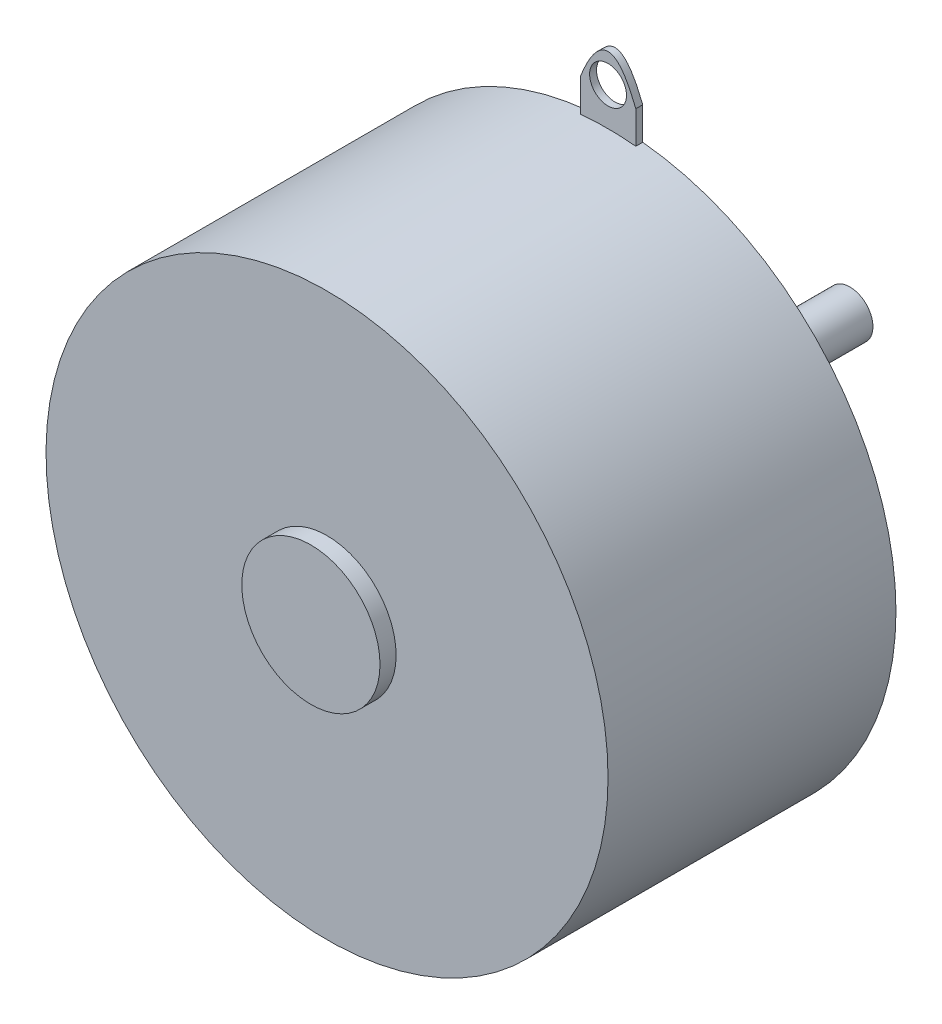
ISO-10303-21;
HEADER;
FILE_DESCRIPTION(('STEP AP214'),'2;1');
FILE_NAME('part.step','',(''),(''),'','','');
FILE_SCHEMA(('AUTOMOTIVE_DESIGN { 1 0 10303 214 1 1 1 1 }'));
ENDSEC;
DATA;
#1=APPLICATION_CONTEXT('core data for automotive mechanical design processes');
#2=APPLICATION_PROTOCOL_DEFINITION('international standard','automotive_design',2000,#1);
#3=PRODUCT_CONTEXT('',#1,'mechanical');
#4=PRODUCT('Part','Part','',(#3));
#5=PRODUCT_RELATED_PRODUCT_CATEGORY('part','',(#4));
#6=PRODUCT_DEFINITION_FORMATION('','',#4);
#7=PRODUCT_DEFINITION_CONTEXT('part definition',#1,'design');
#8=PRODUCT_DEFINITION('design','',#6,#7);
#9=PRODUCT_DEFINITION_SHAPE('','',#8);
#10=(LENGTH_UNIT() NAMED_UNIT(*) SI_UNIT(.MILLI.,.METRE.));
#11=(NAMED_UNIT(*) PLANE_ANGLE_UNIT() SI_UNIT($,.RADIAN.));
#12=(NAMED_UNIT(*) SI_UNIT($,.STERADIAN.) SOLID_ANGLE_UNIT());
#13=UNCERTAINTY_MEASURE_WITH_UNIT(LENGTH_MEASURE(1.E-05),#10,'distance_accuracy_value','');
#14=(GEOMETRIC_REPRESENTATION_CONTEXT(3) GLOBAL_UNCERTAINTY_ASSIGNED_CONTEXT((#13)) GLOBAL_UNIT_ASSIGNED_CONTEXT((#10,
#11,#12)) REPRESENTATION_CONTEXT('',''));
#15=CARTESIAN_POINT('',(0.,0.,0.));
#16=DIRECTION('',(0.,0.,1.));
#17=DIRECTION('',(1.,0.,0.));
#18=AXIS2_PLACEMENT_3D('',#15,#16,#17);
#19=CARTESIAN_POINT('',(0.,0.,-10.2));
#20=DIRECTION('',(0.,0.,1.));
#21=DIRECTION('',(1.,0.,0.));
#22=AXIS2_PLACEMENT_3D('',#19,#20,#21);
#23=CYLINDRICAL_SURFACE('',#22,1.);
#24=CARTESIAN_POINT('',(0.,0.,-10.2));
#25=DIRECTION('',(0.,0.,-1.));
#26=DIRECTION('',(-1.,0.,0.));
#27=AXIS2_PLACEMENT_3D('',#24,#25,#26);
#28=CIRCLE('',#27,1.);
#29=CARTESIAN_POINT('',(-1.,0.,-10.2));
#30=VERTEX_POINT('',#29);
#31=EDGE_CURVE('E230',#30,#30,#28,.T.);
#32=ORIENTED_EDGE('',*,*,#31,.F.);
#33=EDGE_LOOP('',(#32));
#34=FACE_BOUND('',#33,.T.);
#35=CARTESIAN_POINT('',(0.,0.,-0.5));
#36=DIRECTION('',(0.,0.,-1.));
#37=DIRECTION('',(-1.,0.,0.));
#38=AXIS2_PLACEMENT_3D('',#35,#36,#37);
#39=CIRCLE('',#38,1.);
#40=CARTESIAN_POINT('',(-1.,0.,-0.5));
#41=VERTEX_POINT('',#40);
#42=EDGE_CURVE('E306',#41,#41,#39,.T.);
#43=ORIENTED_EDGE('',*,*,#42,.T.);
#44=EDGE_LOOP('',(#43));
#45=FACE_BOUND('',#44,.T.);
#46=CARTESIAN_POINT('',(-0.998705608713358,-0.0508636129711779,-7.33370644444578));
#47=CARTESIAN_POINT('',(-0.998705716944618,-0.0508633764123314,-7.31741865906477));
#48=CARTESIAN_POINT('',(-0.99878075658933,-0.0494477899037423,-7.30112895965556));
#49=CARTESIAN_POINT('',(-0.999041819480778,-0.0438525692223105,-7.26903044913318));
#50=CARTESIAN_POINT('',(-0.999227882597141,-0.0396719420375029,-7.25322181291902));
#51=CARTESIAN_POINT('',(-0.999601583424431,-0.0287441892508261,-7.2225595486397));
#52=CARTESIAN_POINT('',(-0.999789217096529,-0.0220023745424902,-7.20770401821975));
#53=CARTESIAN_POINT('',(-1.00001176989093,-0.0062113170156004,-7.17927558002009));
#54=CARTESIAN_POINT('',(-1.00004666174059,0.00283833757140747,-7.16570290172183));
#55=CARTESIAN_POINT('',(-0.999782342607541,0.023316389049762,-7.139677363146));
#56=CARTESIAN_POINT('',(-0.999470887440874,0.0348195686668742,-7.12728347689725));
#57=CARTESIAN_POINT('',(-0.998297429563808,0.0596354550601853,-7.10449105409454));
#58=CARTESIAN_POINT('',(-0.997435316544868,0.0729485239751973,-7.09409291787484));
#59=CARTESIAN_POINT('',(-0.994943692487863,0.101482225852307,-7.07524397819532));
#60=CARTESIAN_POINT('',(-0.993289309802826,0.116752009141263,-7.06687056943663));
#61=CARTESIAN_POINT('',(-0.989061320789234,0.148363017927186,-7.05280484826686));
#62=CARTESIAN_POINT('',(-0.986487880426897,0.16470404954018,-7.04711205221267));
#63=CARTESIAN_POINT('',(-0.9804369440905,0.197520918305487,-7.03872818200092));
#64=CARTESIAN_POINT('',(-0.97698427456049,0.213982598843931,-7.03596400482312));
#65=CARTESIAN_POINT('',(-0.969182500776432,0.246923989023454,-7.0333029650169));
#66=CARTESIAN_POINT('',(-0.964833643183509,0.26340369246522,-7.03340531446735));
#67=CARTESIAN_POINT('',(-0.9555703758073,0.295209630253265,-7.03642694427336));
#68=CARTESIAN_POINT('',(-0.950685923528052,0.310555565067581,-7.0392322191736));
#69=CARTESIAN_POINT('',(-0.940422986238158,0.340372304548141,-7.04740889286613));
#70=CARTESIAN_POINT('',(-0.935044497019086,0.354843101757834,-7.05278031351963));
#71=CARTESIAN_POINT('',(-0.924052948553754,0.382555493379285,-7.06592659146047));
#72=CARTESIAN_POINT('',(-0.918439799026192,0.395796608262836,-7.07370238128308));
#73=CARTESIAN_POINT('',(-0.907276364629243,0.420757425416011,-7.09143540789827));
#74=CARTESIAN_POINT('',(-0.901726092215073,0.432476830901635,-7.10139306921374));
#75=CARTESIAN_POINT('',(-0.890819949463864,0.454528730919662,-7.12359767966014));
#76=CARTESIAN_POINT('',(-0.885476824623317,0.464801595593181,-7.13591015707379));
#77=CARTESIAN_POINT('',(-0.875531615741424,0.483275022132097,-7.16226948678126));
#78=CARTESIAN_POINT('',(-0.870929618160234,0.491475342277193,-7.17631654109419));
#79=CARTESIAN_POINT('',(-0.862724184131898,0.505743048100308,-7.20600670955148));
#80=CARTESIAN_POINT('',(-0.859136882827554,0.511776340874608,-7.22167072912599));
#81=CARTESIAN_POINT('',(-0.853335817979085,0.52139220763765,-7.25397455698763));
#82=CARTESIAN_POINT('',(-0.851121749310471,0.524975326059367,-7.27061414760842));
#83=CARTESIAN_POINT('',(-0.848288434602472,0.52954116386324,-7.30394677426925));
#84=CARTESIAN_POINT('',(-0.847630232748236,0.530587418986592,-7.32062779280376));
#85=CARTESIAN_POINT('',(-0.847848970441963,0.530237860279917,-7.35395286530404));
#86=CARTESIAN_POINT('',(-0.848725737217097,0.528842321293093,-7.3705969232189));
#87=CARTESIAN_POINT('',(-0.85190782085865,0.523700084088964,-7.40302098846038));
#88=CARTESIAN_POINT('',(-0.854183492332869,0.520002157386236,-7.41881171312303));
#89=CARTESIAN_POINT('',(-0.859963564978484,0.510386054018927,-7.44946445137023));
#90=CARTESIAN_POINT('',(-0.863468129842017,0.504467581563905,-7.46432634092037));
#91=CARTESIAN_POINT('',(-0.871540138277755,0.490392371359663,-7.49303410936871));
#92=CARTESIAN_POINT('',(-0.876127747826425,0.482192562550929,-7.5068531794439));
#93=CARTESIAN_POINT('',(-0.886016017402827,0.463772209848248,-7.53278611368694));
#94=CARTESIAN_POINT('',(-0.891316806075638,0.45355130122652,-7.54489966940109));
#95=CARTESIAN_POINT('',(-0.90244528992017,0.430992441352353,-7.56740300677885));
#96=CARTESIAN_POINT('',(-0.9082831504557,0.418606045419065,-7.577739318976));
#97=CARTESIAN_POINT('',(-0.920002456694621,0.392178598511561,-7.59599009844853));
#98=CARTESIAN_POINT('',(-0.925883897720874,0.37813772275628,-7.60390482186538));
#99=CARTESIAN_POINT('',(-0.937273521242679,0.348941698115296,-7.61697327528439));
#100=CARTESIAN_POINT('',(-0.942785688168521,0.333804271922877,-7.62216304251966));
#101=CARTESIAN_POINT('',(-0.953239314946367,0.302661899830245,-7.62977000463788));
#102=CARTESIAN_POINT('',(-0.958180915683786,0.28665716952693,-7.63218788528325));
#103=CARTESIAN_POINT('',(-0.967130607467775,0.254799981584007,-7.63414484310925));
#104=CARTESIAN_POINT('',(-0.971164458682558,0.238960435055554,-7.6337777969991));
#105=CARTESIAN_POINT('',(-0.978396539401229,0.207371184659519,-7.63041677996104));
#106=CARTESIAN_POINT('',(-0.981594769256603,0.191621480754151,-7.6274228101381));
#107=CARTESIAN_POINT('',(-0.987134762397554,0.160662539840609,-7.61892456075475));
#108=CARTESIAN_POINT('',(-0.989476579069829,0.145453269196534,-7.61342043771922));
#109=CARTESIAN_POINT('',(-0.993362179592225,0.115985934623239,-7.60008001045395));
#110=CARTESIAN_POINT('',(-0.994905797279519,0.101728069287737,-7.59224322116252));
#111=CARTESIAN_POINT('',(-0.997359539766386,0.0739965231068079,-7.57409655299247));
#112=CARTESIAN_POINT('',(-0.998241975811153,0.060576715454563,-7.56370058417415));
#113=CARTESIAN_POINT('',(-0.999446508178879,0.0355519542753818,-7.54088228228631));
#114=CARTESIAN_POINT('',(-0.999768425270063,0.0239475823320898,-7.52845930244718));
#115=CARTESIAN_POINT('',(-1.00005523128115,0.00261266715766117,-7.50149986101968));
#116=CARTESIAN_POINT('',(-1.00000959214432,-0.00705442926915381,-7.48691291484239));
#117=CARTESIAN_POINT('',(-0.999753737395417,-0.0237128610936738,-7.45628818990179));
#118=CARTESIAN_POINT('',(-0.999543621583863,-0.030705815268227,-7.44025129614957));
#119=CARTESIAN_POINT('',(-0.999169647733033,-0.041027924181401,-7.40923289707969));
#120=CARTESIAN_POINT('',(-0.99900328241709,-0.0447031794934045,-7.39436607013143));
#121=CARTESIAN_POINT('',(-0.998771225179704,-0.0496208207894637,-7.36423546837426));
#122=CARTESIAN_POINT('',(-0.998705507276096,-0.0508638346805213,-7.34897179704593));
#123=CARTESIAN_POINT('',(-0.998705608713358,-0.0508636129711779,-7.33370644444578));
#124=B_SPLINE_CURVE_WITH_KNOTS('',3,(#46,#47,#48,#49,#50,#51,#52,#53,#54,#55,#56,#57,#58,#59,
#60,#61,#62,#63,#64,#65,#66,#67,#68,#69,#70,#71,#72,#73,#74,#75,#76,#77,#78,#79,#80,#81,#82,#83,
#84,#85,#86,#87,#88,#89,#90,#91,#92,#93,#94,#95,#96,#97,#98,#99,#100,#101,#102,#103,#104,#105,
#106,#107,#108,#109,#110,#111,#112,#113,#114,#115,#116,#117,#118,#119,#120,#121,#122,#123),
.UNSPECIFIED.,.T.,.F.,(4,2,2,2,2,2,2,2,2,2,2,2,2,2,2,2,2,2,2,2,2,2,2,2,2,2,2,2,2,2,2,2,2,2,2,2,
2,2,4),(0.,0.0488064602400062,0.0976304579198164,0.146353761649586,0.195085764758133,
0.245596912417653,0.296118181714702,0.348341264699459,0.400554921846387,0.451432106442574,
0.502295306582772,0.551103014191679,0.599911137604854,0.648738215057718,0.697574801158179,
0.748047777990534,0.798526638758741,0.849768066157882,0.900998103920283,0.950931192321792,
1.00085866072159,1.04976290054783,1.09867365703569,1.14857909444745,1.19849354602958,
1.24971557332734,1.30093218078499,1.35145321547015,1.40196174859477,1.45077545222193,
1.49958913531665,1.54839977496721,1.59722057154882,1.64798640987592,1.69876847812973,
1.7510101809105,1.80322020922216,1.84897475618952,1.89471748961215),.UNSPECIFIED.);
#125=CARTESIAN_POINT('',(-0.998705608713358,-0.0508636129711779,-7.33370644444578));
#126=VERTEX_POINT('',#125);
#127=EDGE_CURVE('E41',#126,#126,#124,.T.);
#128=ORIENTED_EDGE('',*,*,#127,.F.);
#129=EDGE_LOOP('',(#128));
#130=FACE_BOUND('',#129,.T.);
#131=ADVANCED_FACE('F37',(#34,#45,#130),#23,.T.);
#132=CARTESIAN_POINT('',(0.,0.,-1.));
#133=DIRECTION('',(0.,0.,1.));
#134=DIRECTION('',(1.,0.,0.));
#135=AXIS2_PLACEMENT_3D('',#132,#133,#134);
#136=CYLINDRICAL_SURFACE('',#135,3.25);
#137=CARTESIAN_POINT('',(0.,0.,0.));
#138=DIRECTION('',(0.,0.,-1.));
#139=DIRECTION('',(-1.,0.,0.));
#140=AXIS2_PLACEMENT_3D('',#137,#138,#139);
#141=CIRCLE('',#140,3.25);
#142=CARTESIAN_POINT('',(-3.25,0.,0.));
#143=VERTEX_POINT('',#142);
#144=EDGE_CURVE('E11',#143,#143,#141,.T.);
#145=ORIENTED_EDGE('',*,*,#144,.T.);
#146=EDGE_LOOP('',(#145));
#147=FACE_BOUND('',#146,.T.);
#148=CARTESIAN_POINT('',(0.,0.,-0.5));
#149=DIRECTION('',(0.,0.,-1.));
#150=DIRECTION('',(-1.,0.,0.));
#151=AXIS2_PLACEMENT_3D('',#148,#149,#150);
#152=CIRCLE('',#151,3.25);
#153=CARTESIAN_POINT('',(-3.25,0.,-0.5));
#154=VERTEX_POINT('',#153);
#155=EDGE_CURVE('E302',#154,#154,#152,.T.);
#156=ORIENTED_EDGE('',*,*,#155,.F.);
#157=EDGE_LOOP('',(#156));
#158=FACE_BOUND('',#157,.T.);
#159=ADVANCED_FACE('F322',(#147,#158),#136,.T.);
#160=CARTESIAN_POINT('',(0.,0.,12.5));
#161=DIRECTION('',(0.,0.,-1.));
#162=DIRECTION('',(-1.,0.,0.));
#163=AXIS2_PLACEMENT_3D('',#160,#161,#162);
#164=CYLINDRICAL_SURFACE('',#163,12.2);
#165=CARTESIAN_POINT('',(0.,0.,0.3));
#166=DIRECTION('',(0.,0.,-1.));
#167=DIRECTION('',(-1.,0.,0.));
#168=AXIS2_PLACEMENT_3D('',#165,#166,#167);
#169=CIRCLE('',#168,12.2);
#170=CARTESIAN_POINT('',(1.20565428691612,-12.140279969607,0.3));
#171=VERTEX_POINT('',#170);
#172=CARTESIAN_POINT('',(-1.20565428691612,-12.140279969607,0.3));
#173=VERTEX_POINT('',#172);
#174=EDGE_CURVE('E64',#171,#173,#169,.T.);
#175=ORIENTED_EDGE('',*,*,#174,.F.);
#176=DIRECTION('',(0.,0.,-1.));
#177=VECTOR('',#176,1.);
#178=CARTESIAN_POINT('',(1.20565428691612,-12.140279969607,0.3));
#179=LINE('',#178,#177);
#180=CARTESIAN_POINT('',(1.20565428691612,-12.140279969607,0.));
#181=VERTEX_POINT('',#180);
#182=EDGE_CURVE('E129',#171,#181,#179,.T.);
#183=ORIENTED_EDGE('',*,*,#182,.T.);
#184=CARTESIAN_POINT('',(0.,0.,0.));
#185=DIRECTION('',(0.,0.,1.));
#186=DIRECTION('',(1.,0.,0.));
#187=AXIS2_PLACEMENT_3D('',#184,#185,#186);
#188=CIRCLE('',#187,12.2);
#189=CARTESIAN_POINT('',(1.20565428691612,12.140279969607,0.));
#190=VERTEX_POINT('',#189);
#191=EDGE_CURVE('E268',#181,#190,#188,.T.);
#192=ORIENTED_EDGE('',*,*,#191,.T.);
#193=DIRECTION('',(0.,0.,-1.));
#194=VECTOR('',#193,1.);
#195=CARTESIAN_POINT('',(1.20565428691612,12.140279969607,0.3));
#196=LINE('',#195,#194);
#197=CARTESIAN_POINT('',(1.20565428691612,12.140279969607,0.3));
#198=VERTEX_POINT('',#197);
#199=EDGE_CURVE('E222',#198,#190,#196,.T.);
#200=ORIENTED_EDGE('',*,*,#199,.F.);
#201=CARTESIAN_POINT('',(0.,0.,0.3));
#202=DIRECTION('',(0.,0.,-1.));
#203=DIRECTION('',(-1.,0.,0.));
#204=AXIS2_PLACEMENT_3D('',#201,#202,#203);
#205=CIRCLE('',#204,12.2);
#206=CARTESIAN_POINT('',(-1.20565428691612,12.140279969607,0.3));
#207=VERTEX_POINT('',#206);
#208=EDGE_CURVE('E191',#207,#198,#205,.T.);
#209=ORIENTED_EDGE('',*,*,#208,.F.);
#210=DIRECTION('',(0.,0.,-1.));
#211=VECTOR('',#210,1.);
#212=CARTESIAN_POINT('',(-1.20565428691612,12.140279969607,0.3));
#213=LINE('',#212,#211);
#214=CARTESIAN_POINT('',(-1.20565428691612,12.140279969607,0.));
#215=VERTEX_POINT('',#214);
#216=EDGE_CURVE('E219',#207,#215,#213,.T.);
#217=ORIENTED_EDGE('',*,*,#216,.T.);
#218=CARTESIAN_POINT('',(-1.20565428691612,-12.140279969607,0.));
#219=VERTEX_POINT('',#218);
#220=EDGE_CURVE('E273',#215,#219,#188,.T.);
#221=ORIENTED_EDGE('',*,*,#220,.T.);
#222=DIRECTION('',(0.,0.,-1.));
#223=VECTOR('',#222,1.);
#224=CARTESIAN_POINT('',(-1.20565428691612,-12.140279969607,0.3));
#225=LINE('',#224,#223);
#226=EDGE_CURVE('E59',#173,#219,#225,.T.);
#227=ORIENTED_EDGE('',*,*,#226,.F.);
#228=EDGE_LOOP('',(#175,#183,#192,#200,#209,#217,#221,#227));
#229=FACE_BOUND('',#228,.T.);
#230=CARTESIAN_POINT('',(0.,0.,12.5));
#231=DIRECTION('',(0.,0.,1.));
#232=DIRECTION('',(1.,0.,0.));
#233=AXIS2_PLACEMENT_3D('',#230,#231,#232);
#234=CIRCLE('',#233,12.2);
#235=CARTESIAN_POINT('',(12.2,0.,12.5));
#236=VERTEX_POINT('',#235);
#237=EDGE_CURVE('E271',#236,#236,#234,.T.);
#238=ORIENTED_EDGE('',*,*,#237,.F.);
#239=EDGE_LOOP('',(#238));
#240=FACE_BOUND('',#239,.T.);
#241=ADVANCED_FACE('F39',(#229,#240),#164,.T.);
#242=CARTESIAN_POINT('',(0.,0.,12.5));
#243=DIRECTION('',(0.,0.,1.));
#244=DIRECTION('',(1.,0.,0.));
#245=AXIS2_PLACEMENT_3D('',#242,#243,#244);
#246=PLANE('',#245);
#247=CARTESIAN_POINT('',(0.,0.,12.5));
#248=DIRECTION('',(0.,0.,1.));
#249=DIRECTION('',(1.,0.,0.));
#250=AXIS2_PLACEMENT_3D('',#247,#248,#249);
#251=CIRCLE('',#250,3.);
#252=CARTESIAN_POINT('',(3.,0.,12.5));
#253=VERTEX_POINT('',#252);
#254=EDGE_CURVE('E51',#253,#253,#251,.T.);
#255=ORIENTED_EDGE('',*,*,#254,.F.);
#256=EDGE_LOOP('',(#255));
#257=FACE_BOUND('',#256,.T.);
#258=ORIENTED_EDGE('',*,*,#237,.T.);
#259=EDGE_LOOP('',(#258));
#260=FACE_BOUND('',#259,.T.);
#261=ADVANCED_FACE('F295',(#257,#260),#246,.T.);
#262=CARTESIAN_POINT('',(0.,0.,0.));
#263=DIRECTION('',(0.,0.,1.));
#264=DIRECTION('',(1.,0.,0.));
#265=AXIS2_PLACEMENT_3D('',#262,#263,#264);
#266=PLANE('',#265);
#267=CARTESIAN_POINT('',(0.,8.25,0.));
#268=DIRECTION('',(0.,0.,-1.));
#269=DIRECTION('',(-1.,0.,0.));
#270=AXIS2_PLACEMENT_3D('',#267,#268,#269);
#271=CIRCLE('',#270,0.85);
#272=CARTESIAN_POINT('',(-0.85,8.25,0.));
#273=VERTEX_POINT('',#272);
#274=EDGE_CURVE('E231',#273,#273,#271,.T.);
#275=ORIENTED_EDGE('',*,*,#274,.F.);
#276=EDGE_LOOP('',(#275));
#277=FACE_BOUND('',#276,.T.);
#278=CARTESIAN_POINT('',(-7.14470958122185,4.12500000000041,0.));
#279=DIRECTION('',(0.,0.,-1.));
#280=DIRECTION('',(-1.,0.,0.));
#281=AXIS2_PLACEMENT_3D('',#278,#279,#280);
#282=CIRCLE('',#281,0.850000000000126);
#283=CARTESIAN_POINT('',(-7.99470958122198,4.12500000000041,0.));
#284=VERTEX_POINT('',#283);
#285=EDGE_CURVE('E235',#284,#284,#282,.T.);
#286=ORIENTED_EDGE('',*,*,#285,.F.);
#287=EDGE_LOOP('',(#286));
#288=FACE_BOUND('',#287,.T.);
#289=CARTESIAN_POINT('',(-7.14470958122232,-4.12499999999959,0.));
#290=DIRECTION('',(0.,0.,-1.));
#291=DIRECTION('',(-1.,0.,0.));
#292=AXIS2_PLACEMENT_3D('',#289,#290,#291);
#293=CIRCLE('',#292,0.850000000000591);
#294=CARTESIAN_POINT('',(-7.99470958122291,-4.12499999999959,0.));
#295=VERTEX_POINT('',#294);
#296=EDGE_CURVE('E258',#295,#295,#293,.T.);
#297=ORIENTED_EDGE('',*,*,#296,.F.);
#298=EDGE_LOOP('',(#297));
#299=FACE_BOUND('',#298,.T.);
#300=CARTESIAN_POINT('',(-9.35895743984739E-13,-8.25,0.));
#301=DIRECTION('',(0.,0.,-1.));
#302=DIRECTION('',(-1.,0.,0.));
#303=AXIS2_PLACEMENT_3D('',#300,#301,#302);
#304=CIRCLE('',#303,0.85000000000095);
#305=CARTESIAN_POINT('',(-0.850000000001886,-8.25,0.));
#306=VERTEX_POINT('',#305);
#307=EDGE_CURVE('E252',#306,#306,#304,.T.);
#308=ORIENTED_EDGE('',*,*,#307,.F.);
#309=EDGE_LOOP('',(#308));
#310=FACE_BOUND('',#309,.T.);
#311=CARTESIAN_POINT('',(7.14470958122092,-4.12500000000041,0.));
#312=DIRECTION('',(0.,0.,-1.));
#313=DIRECTION('',(-1.,0.,0.));
#314=AXIS2_PLACEMENT_3D('',#311,#312,#313);
#315=CIRCLE('',#314,0.850000000000865);
#316=CARTESIAN_POINT('',(6.29470958122005,-4.12500000000041,0.));
#317=VERTEX_POINT('',#316);
#318=EDGE_CURVE('E246',#317,#317,#315,.T.);
#319=ORIENTED_EDGE('',*,*,#318,.F.);
#320=EDGE_LOOP('',(#319));
#321=FACE_BOUND('',#320,.T.);
#322=CARTESIAN_POINT('',(7.14470958122139,4.12499999999959,0.));
#323=DIRECTION('',(0.,0.,-1.));
#324=DIRECTION('',(-1.,0.,0.));
#325=AXIS2_PLACEMENT_3D('',#322,#323,#324);
#326=CIRCLE('',#325,0.85000000000044);
#327=CARTESIAN_POINT('',(6.29470958122095,4.12499999999959,0.));
#328=VERTEX_POINT('',#327);
#329=EDGE_CURVE('E234',#328,#328,#326,.T.);
#330=ORIENTED_EDGE('',*,*,#329,.F.);
#331=EDGE_LOOP('',(#330));
#332=FACE_BOUND('',#331,.T.);
#333=ORIENTED_EDGE('',*,*,#144,.F.);
#334=EDGE_LOOP('',(#333));
#335=FACE_BOUND('',#334,.T.);
#336=ORIENTED_EDGE('',*,*,#220,.F.);
#337=DIRECTION('',(0.,1.,0.));
#338=VECTOR('',#337,1.);
#339=CARTESIAN_POINT('',(-1.20565428691612,0.,0.));
#340=LINE('',#339,#338);
#341=CARTESIAN_POINT('',(-1.20565428691612,13.550279969607,0.));
#342=VERTEX_POINT('',#341);
#343=EDGE_CURVE('E211',#215,#342,#340,.T.);
#344=ORIENTED_EDGE('',*,*,#343,.T.);
#345=CARTESIAN_POINT('',(1.20565428691612,13.550279969607,0.));
#346=CARTESIAN_POINT('',(0.,16.6469458550906,0.));
#347=CARTESIAN_POINT('',(-1.20565428691612,13.550279969607,0.));
#348=B_SPLINE_CURVE_WITH_KNOTS('',2,(#345,#346,#347),.UNSPECIFIED.,.F.,.F.,(3,3),(0.,1.),.UNSPECIFIED.);
#349=CARTESIAN_POINT('',(1.20565428691612,13.550279969607,0.));
#350=VERTEX_POINT('',#349);
#351=EDGE_CURVE('E201',#350,#342,#348,.T.);
#352=ORIENTED_EDGE('',*,*,#351,.F.);
#353=DIRECTION('',(0.,1.,0.));
#354=VECTOR('',#353,1.);
#355=CARTESIAN_POINT('',(1.20565428691612,0.,0.));
#356=LINE('',#355,#354);
#357=EDGE_CURVE('E206',#190,#350,#356,.T.);
#358=ORIENTED_EDGE('',*,*,#357,.F.);
#359=ORIENTED_EDGE('',*,*,#191,.F.);
#360=DIRECTION('',(0.,-1.,0.));
#361=VECTOR('',#360,1.);
#362=CARTESIAN_POINT('',(1.20565428691612,0.,0.));
#363=LINE('',#362,#361);
#364=CARTESIAN_POINT('',(1.20565428691612,-13.550279969607,0.));
#365=VERTEX_POINT('',#364);
#366=EDGE_CURVE('E301',#181,#365,#363,.T.);
#367=ORIENTED_EDGE('',*,*,#366,.T.);
#368=CARTESIAN_POINT('',(1.20565428691612,-13.550279969607,0.));
#369=CARTESIAN_POINT('',(0.,-16.6469458550906,0.));
#370=CARTESIAN_POINT('',(-1.20565428691612,-13.550279969607,0.));
#371=B_SPLINE_CURVE_WITH_KNOTS('',2,(#368,#369,#370),.UNSPECIFIED.,.F.,.F.,(3,3),(0.,1.),.UNSPECIFIED.);
#372=CARTESIAN_POINT('',(-1.20565428691612,-13.550279969607,0.));
#373=VERTEX_POINT('',#372);
#374=EDGE_CURVE('E114',#365,#373,#371,.T.);
#375=ORIENTED_EDGE('',*,*,#374,.T.);
#376=DIRECTION('',(0.,-1.,0.));
#377=VECTOR('',#376,1.);
#378=CARTESIAN_POINT('',(-1.20565428691612,0.,0.));
#379=LINE('',#378,#377);
#380=EDGE_CURVE('E133',#219,#373,#379,.T.);
#381=ORIENTED_EDGE('',*,*,#380,.F.);
#382=EDGE_LOOP('',(#336,#344,#352,#358,#359,#367,#375,#381));
#383=FACE_BOUND('',#382,.T.);
#384=CARTESIAN_POINT('',(0.,13.85,0.));
#385=DIRECTION('',(0.,0.,-1.));
#386=DIRECTION('',(-1.,0.,0.));
#387=AXIS2_PLACEMENT_3D('',#384,#385,#386);
#388=CIRCLE('',#387,0.8);
#389=CARTESIAN_POINT('',(-0.8,13.85,0.));
#390=VERTEX_POINT('',#389);
#391=EDGE_CURVE('E185',#390,#390,#388,.T.);
#392=ORIENTED_EDGE('',*,*,#391,.F.);
#393=EDGE_LOOP('',(#392));
#394=FACE_BOUND('',#393,.T.);
#395=CARTESIAN_POINT('',(0.,-13.85,0.));
#396=DIRECTION('',(0.,0.,-1.));
#397=DIRECTION('',(-1.,0.,0.));
#398=AXIS2_PLACEMENT_3D('',#395,#396,#397);
#399=CIRCLE('',#398,0.8);
#400=CARTESIAN_POINT('',(-0.8,-13.85,0.));
#401=VERTEX_POINT('',#400);
#402=EDGE_CURVE('E299',#401,#401,#399,.F.);
#403=ORIENTED_EDGE('',*,*,#402,.T.);
#404=EDGE_LOOP('',(#403));
#405=FACE_BOUND('',#404,.T.);
#406=ADVANCED_FACE('F281',(#277,#288,#299,#310,#321,#332,#335,#383,#394,#405),#266,.F.);
#407=CARTESIAN_POINT('',(0.,0.,13.2));
#408=DIRECTION('',(0.,0.,-1.));
#409=DIRECTION('',(-1.,0.,0.));
#410=AXIS2_PLACEMENT_3D('',#407,#408,#409);
#411=CYLINDRICAL_SURFACE('',#410,3.);
#412=CARTESIAN_POINT('',(0.,0.,13.2));
#413=DIRECTION('',(0.,0.,1.));
#414=DIRECTION('',(1.,0.,0.));
#415=AXIS2_PLACEMENT_3D('',#412,#413,#414);
#416=CIRCLE('',#415,3.);
#417=CARTESIAN_POINT('',(3.,0.,13.2));
#418=VERTEX_POINT('',#417);
#419=EDGE_CURVE('E264',#418,#418,#416,.T.);
#420=ORIENTED_EDGE('',*,*,#419,.F.);
#421=EDGE_LOOP('',(#420));
#422=FACE_BOUND('',#421,.T.);
#423=ORIENTED_EDGE('',*,*,#254,.T.);
#424=EDGE_LOOP('',(#423));
#425=FACE_BOUND('',#424,.T.);
#426=ADVANCED_FACE('F294',(#422,#425),#411,.T.);
#427=CARTESIAN_POINT('',(0.,0.,13.2));
#428=DIRECTION('',(0.,0.,1.));
#429=DIRECTION('',(1.,0.,0.));
#430=AXIS2_PLACEMENT_3D('',#427,#428,#429);
#431=PLANE('',#430);
#432=ORIENTED_EDGE('',*,*,#419,.T.);
#433=EDGE_LOOP('',(#432));
#434=FACE_BOUND('',#433,.T.);
#435=ADVANCED_FACE('F338',(#434),#431,.T.);
#436=CARTESIAN_POINT('',(7.14470958122139,4.12499999999959,0.35));
#437=DIRECTION('',(0.,0.,-1.));
#438=DIRECTION('',(-1.,0.,0.));
#439=AXIS2_PLACEMENT_3D('',#436,#437,#438);
#440=CYLINDRICAL_SURFACE('',#439,0.85000000000044);
#441=CARTESIAN_POINT('',(7.14470958122139,4.12499999999959,0.35));
#442=DIRECTION('',(0.,0.,-1.));
#443=DIRECTION('',(-1.,0.,0.));
#444=AXIS2_PLACEMENT_3D('',#441,#442,#443);
#445=CIRCLE('',#444,0.85000000000044);
#446=CARTESIAN_POINT('',(6.29470958122095,4.12499999999959,0.35));
#447=VERTEX_POINT('',#446);
#448=EDGE_CURVE('E243',#447,#447,#445,.T.);
#449=ORIENTED_EDGE('',*,*,#448,.F.);
#450=EDGE_LOOP('',(#449));
#451=FACE_BOUND('',#450,.T.);
#452=ORIENTED_EDGE('',*,*,#329,.T.);
#453=EDGE_LOOP('',(#452));
#454=FACE_BOUND('',#453,.T.);
#455=ADVANCED_FACE('F341',(#451,#454),#440,.F.);
#456=CARTESIAN_POINT('',(7.14470958122139,4.12499999999959,0.35));
#457=DIRECTION('',(0.,0.,-1.));
#458=DIRECTION('',(-1.,0.,0.));
#459=AXIS2_PLACEMENT_3D('',#456,#457,#458);
#460=PLANE('',#459);
#461=ORIENTED_EDGE('',*,*,#448,.T.);
#462=EDGE_LOOP('',(#461));
#463=FACE_BOUND('',#462,.T.);
#464=ADVANCED_FACE('F441',(#463),#460,.T.);
#465=CARTESIAN_POINT('',(7.14470958122092,-4.12500000000041,0.35));
#466=DIRECTION('',(0.,0.,-1.));
#467=DIRECTION('',(-1.,0.,0.));
#468=AXIS2_PLACEMENT_3D('',#465,#466,#467);
#469=CYLINDRICAL_SURFACE('',#468,0.850000000000865);
#470=CARTESIAN_POINT('',(7.14470958122092,-4.12500000000041,0.35));
#471=DIRECTION('',(0.,0.,-1.));
#472=DIRECTION('',(-1.,0.,0.));
#473=AXIS2_PLACEMENT_3D('',#470,#471,#472);
#474=CIRCLE('',#473,0.850000000000865);
#475=CARTESIAN_POINT('',(6.29470958122005,-4.12500000000041,0.35));
#476=VERTEX_POINT('',#475);
#477=EDGE_CURVE('E249',#476,#476,#474,.T.);
#478=ORIENTED_EDGE('',*,*,#477,.F.);
#479=EDGE_LOOP('',(#478));
#480=FACE_BOUND('',#479,.T.);
#481=ORIENTED_EDGE('',*,*,#318,.T.);
#482=EDGE_LOOP('',(#481));
#483=FACE_BOUND('',#482,.T.);
#484=ADVANCED_FACE('F451',(#480,#483),#469,.F.);
#485=CARTESIAN_POINT('',(7.14470958122092,-4.12500000000041,0.35));
#486=DIRECTION('',(0.,0.,-1.));
#487=DIRECTION('',(-1.,0.,0.));
#488=AXIS2_PLACEMENT_3D('',#485,#486,#487);
#489=PLANE('',#488);
#490=ORIENTED_EDGE('',*,*,#477,.T.);
#491=EDGE_LOOP('',(#490));
#492=FACE_BOUND('',#491,.T.);
#493=ADVANCED_FACE('F461',(#492),#489,.T.);
#494=CARTESIAN_POINT('',(-9.35895743984739E-13,-8.25,0.35));
#495=DIRECTION('',(0.,0.,-1.));
#496=DIRECTION('',(-1.,0.,0.));
#497=AXIS2_PLACEMENT_3D('',#494,#495,#496);
#498=CYLINDRICAL_SURFACE('',#497,0.85000000000095);
#499=CARTESIAN_POINT('',(-9.35895743984739E-13,-8.25,0.35));
#500=DIRECTION('',(0.,0.,-1.));
#501=DIRECTION('',(-1.,0.,0.));
#502=AXIS2_PLACEMENT_3D('',#499,#500,#501);
#503=CIRCLE('',#502,0.85000000000095);
#504=CARTESIAN_POINT('',(-0.850000000001886,-8.25,0.35));
#505=VERTEX_POINT('',#504);
#506=EDGE_CURVE('E255',#505,#505,#503,.T.);
#507=ORIENTED_EDGE('',*,*,#506,.F.);
#508=EDGE_LOOP('',(#507));
#509=FACE_BOUND('',#508,.T.);
#510=ORIENTED_EDGE('',*,*,#307,.T.);
#511=EDGE_LOOP('',(#510));
#512=FACE_BOUND('',#511,.T.);
#513=ADVANCED_FACE('F471',(#509,#512),#498,.F.);
#514=CARTESIAN_POINT('',(-9.35895743984739E-13,-8.25,0.35));
#515=DIRECTION('',(0.,0.,-1.));
#516=DIRECTION('',(-1.,0.,0.));
#517=AXIS2_PLACEMENT_3D('',#514,#515,#516);
#518=PLANE('',#517);
#519=ORIENTED_EDGE('',*,*,#506,.T.);
#520=EDGE_LOOP('',(#519));
#521=FACE_BOUND('',#520,.T.);
#522=ADVANCED_FACE('F481',(#521),#518,.T.);
#523=CARTESIAN_POINT('',(-7.14470958122232,-4.12499999999959,0.35));
#524=DIRECTION('',(0.,0.,-1.));
#525=DIRECTION('',(-1.,0.,0.));
#526=AXIS2_PLACEMENT_3D('',#523,#524,#525);
#527=CYLINDRICAL_SURFACE('',#526,0.850000000000591);
#528=CARTESIAN_POINT('',(-7.14470958122232,-4.12499999999959,0.35));
#529=DIRECTION('',(0.,0.,-1.));
#530=DIRECTION('',(-1.,0.,0.));
#531=AXIS2_PLACEMENT_3D('',#528,#529,#530);
#532=CIRCLE('',#531,0.850000000000591);
#533=CARTESIAN_POINT('',(-7.99470958122291,-4.12499999999959,0.35));
#534=VERTEX_POINT('',#533);
#535=EDGE_CURVE('E238',#534,#534,#532,.T.);
#536=ORIENTED_EDGE('',*,*,#535,.F.);
#537=EDGE_LOOP('',(#536));
#538=FACE_BOUND('',#537,.T.);
#539=ORIENTED_EDGE('',*,*,#296,.T.);
#540=EDGE_LOOP('',(#539));
#541=FACE_BOUND('',#540,.T.);
#542=ADVANCED_FACE('F491',(#538,#541),#527,.F.);
#543=CARTESIAN_POINT('',(-7.14470958122232,-4.12499999999959,0.35));
#544=DIRECTION('',(0.,0.,-1.));
#545=DIRECTION('',(-1.,0.,0.));
#546=AXIS2_PLACEMENT_3D('',#543,#544,#545);
#547=PLANE('',#546);
#548=ORIENTED_EDGE('',*,*,#535,.T.);
#549=EDGE_LOOP('',(#548));
#550=FACE_BOUND('',#549,.T.);
#551=ADVANCED_FACE('F501',(#550),#547,.T.);
#552=CARTESIAN_POINT('',(-7.14470958122185,4.12500000000041,0.35));
#553=DIRECTION('',(0.,0.,-1.));
#554=DIRECTION('',(-1.,0.,0.));
#555=AXIS2_PLACEMENT_3D('',#552,#553,#554);
#556=CYLINDRICAL_SURFACE('',#555,0.850000000000126);
#557=CARTESIAN_POINT('',(-7.14470958122185,4.12500000000041,0.35));
#558=DIRECTION('',(0.,0.,-1.));
#559=DIRECTION('',(-1.,0.,0.));
#560=AXIS2_PLACEMENT_3D('',#557,#558,#559);
#561=CIRCLE('',#560,0.850000000000126);
#562=CARTESIAN_POINT('',(-7.99470958122198,4.12500000000041,0.35));
#563=VERTEX_POINT('',#562);
#564=EDGE_CURVE('E218',#563,#563,#561,.T.);
#565=ORIENTED_EDGE('',*,*,#564,.F.);
#566=EDGE_LOOP('',(#565));
#567=FACE_BOUND('',#566,.T.);
#568=ORIENTED_EDGE('',*,*,#285,.T.);
#569=EDGE_LOOP('',(#568));
#570=FACE_BOUND('',#569,.T.);
#571=ADVANCED_FACE('F511',(#567,#570),#556,.F.);
#572=CARTESIAN_POINT('',(-7.14470958122185,4.12500000000041,0.35));
#573=DIRECTION('',(0.,0.,-1.));
#574=DIRECTION('',(-1.,0.,0.));
#575=AXIS2_PLACEMENT_3D('',#572,#573,#574);
#576=PLANE('',#575);
#577=ORIENTED_EDGE('',*,*,#564,.T.);
#578=EDGE_LOOP('',(#577));
#579=FACE_BOUND('',#578,.T.);
#580=ADVANCED_FACE('F520',(#579),#576,.T.);
#581=CARTESIAN_POINT('',(0.,8.25,0.35));
#582=DIRECTION('',(0.,0.,-1.));
#583=DIRECTION('',(-1.,0.,0.));
#584=AXIS2_PLACEMENT_3D('',#581,#582,#583);
#585=CYLINDRICAL_SURFACE('',#584,0.85);
#586=CARTESIAN_POINT('',(0.,8.25,0.35));
#587=DIRECTION('',(0.,0.,-1.));
#588=DIRECTION('',(-1.,0.,0.));
#589=AXIS2_PLACEMENT_3D('',#586,#587,#588);
#590=CIRCLE('',#589,0.85);
#591=CARTESIAN_POINT('',(-0.85,8.25,0.35));
#592=VERTEX_POINT('',#591);
#593=EDGE_CURVE('E227',#592,#592,#590,.T.);
#594=ORIENTED_EDGE('',*,*,#593,.F.);
#595=EDGE_LOOP('',(#594));
#596=FACE_BOUND('',#595,.T.);
#597=ORIENTED_EDGE('',*,*,#274,.T.);
#598=EDGE_LOOP('',(#597));
#599=FACE_BOUND('',#598,.T.);
#600=ADVANCED_FACE('F530',(#596,#599),#585,.F.);
#601=CARTESIAN_POINT('',(0.,8.25,0.35));
#602=DIRECTION('',(0.,0.,-1.));
#603=DIRECTION('',(-1.,0.,0.));
#604=AXIS2_PLACEMENT_3D('',#601,#602,#603);
#605=PLANE('',#604);
#606=ORIENTED_EDGE('',*,*,#593,.T.);
#607=EDGE_LOOP('',(#606));
#608=FACE_BOUND('',#607,.T.);
#609=ADVANCED_FACE('F176',(#608),#605,.T.);
#610=CARTESIAN_POINT('',(1.20565428691612,13.550279969607,0.3));
#611=CARTESIAN_POINT('',(0.,16.6469458550906,0.3));
#612=CARTESIAN_POINT('',(-1.20565428691612,13.550279969607,0.3));
#613=B_SPLINE_CURVE_WITH_KNOTS('',2,(#610,#611,#612),.UNSPECIFIED.,.F.,.F.,(3,3),(0.,1.),.UNSPECIFIED.);
#614=DIRECTION('',(0.,0.,-1.));
#615=VECTOR('',#614,1.);
#616=SURFACE_OF_LINEAR_EXTRUSION('',#613,#615);
#617=ORIENTED_EDGE('',*,*,#351,.T.);
#618=DIRECTION('',(0.,0.,-1.));
#619=VECTOR('',#618,1.);
#620=CARTESIAN_POINT('',(-1.20565428691612,13.550279969607,0.3));
#621=LINE('',#620,#619);
#622=CARTESIAN_POINT('',(-1.20565428691612,13.550279969607,0.3));
#623=VERTEX_POINT('',#622);
#624=EDGE_CURVE('E216',#623,#342,#621,.T.);
#625=ORIENTED_EDGE('',*,*,#624,.F.);
#626=CARTESIAN_POINT('',(1.20565428691612,13.550279969607,0.3));
#627=VERTEX_POINT('',#626);
#628=EDGE_CURVE('E179',#627,#623,#613,.T.);
#629=ORIENTED_EDGE('',*,*,#628,.F.);
#630=DIRECTION('',(0.,0.,-1.));
#631=VECTOR('',#630,1.);
#632=CARTESIAN_POINT('',(1.20565428691612,13.550279969607,0.3));
#633=LINE('',#632,#631);
#634=EDGE_CURVE('E200',#627,#350,#633,.T.);
#635=ORIENTED_EDGE('',*,*,#634,.T.);
#636=EDGE_LOOP('',(#617,#625,#629,#635));
#637=FACE_BOUND('',#636,.T.);
#638=ADVANCED_FACE('F168',(#637),#616,.F.);
#639=CARTESIAN_POINT('',(-1.20565428691612,0.,0.3));
#640=DIRECTION('',(-1.,0.,0.));
#641=DIRECTION('',(0.,0.,1.));
#642=AXIS2_PLACEMENT_3D('',#639,#640,#641);
#643=PLANE('',#642);
#644=ORIENTED_EDGE('',*,*,#343,.F.);
#645=ORIENTED_EDGE('',*,*,#216,.F.);
#646=DIRECTION('',(0.,1.,0.));
#647=VECTOR('',#646,1.);
#648=CARTESIAN_POINT('',(-1.20565428691612,0.,0.3));
#649=LINE('',#648,#647);
#650=EDGE_CURVE('E194',#207,#623,#649,.T.);
#651=ORIENTED_EDGE('',*,*,#650,.T.);
#652=ORIENTED_EDGE('',*,*,#624,.T.);
#653=EDGE_LOOP('',(#644,#645,#651,#652));
#654=FACE_BOUND('',#653,.T.);
#655=ADVANCED_FACE('F165',(#654),#643,.T.);
#656=CARTESIAN_POINT('',(1.20565428691612,0.,0.3));
#657=DIRECTION('',(-1.,0.,0.));
#658=DIRECTION('',(0.,0.,1.));
#659=AXIS2_PLACEMENT_3D('',#656,#657,#658);
#660=PLANE('',#659);
#661=ORIENTED_EDGE('',*,*,#357,.T.);
#662=ORIENTED_EDGE('',*,*,#634,.F.);
#663=DIRECTION('',(0.,1.,0.));
#664=VECTOR('',#663,1.);
#665=CARTESIAN_POINT('',(1.20565428691612,0.,0.3));
#666=LINE('',#665,#664);
#667=EDGE_CURVE('E184',#198,#627,#666,.T.);
#668=ORIENTED_EDGE('',*,*,#667,.F.);
#669=ORIENTED_EDGE('',*,*,#199,.T.);
#670=EDGE_LOOP('',(#661,#662,#668,#669));
#671=FACE_BOUND('',#670,.T.);
#672=ADVANCED_FACE('F163',(#671),#660,.F.);
#673=CARTESIAN_POINT('',(0.,13.85,0.3));
#674=DIRECTION('',(0.,0.,-1.));
#675=DIRECTION('',(-1.,0.,0.));
#676=AXIS2_PLACEMENT_3D('',#673,#674,#675);
#677=CYLINDRICAL_SURFACE('',#676,0.8);
#678=CARTESIAN_POINT('',(0.,13.85,0.3));
#679=DIRECTION('',(0.,0.,-1.));
#680=DIRECTION('',(-1.,0.,0.));
#681=AXIS2_PLACEMENT_3D('',#678,#679,#680);
#682=CIRCLE('',#681,0.8);
#683=CARTESIAN_POINT('',(-0.8,13.85,0.3));
#684=VERTEX_POINT('',#683);
#685=EDGE_CURVE('E197',#684,#684,#682,.T.);
#686=ORIENTED_EDGE('',*,*,#685,.F.);
#687=EDGE_LOOP('',(#686));
#688=FACE_BOUND('',#687,.T.);
#689=ORIENTED_EDGE('',*,*,#391,.T.);
#690=EDGE_LOOP('',(#689));
#691=FACE_BOUND('',#690,.T.);
#692=ADVANCED_FACE('F159',(#688,#691),#677,.F.);
#693=CARTESIAN_POINT('',(0.,0.,0.3));
#694=DIRECTION('',(0.,0.,-1.));
#695=DIRECTION('',(-1.,0.,0.));
#696=AXIS2_PLACEMENT_3D('',#693,#694,#695);
#697=PLANE('',#696);
#698=ORIENTED_EDGE('',*,*,#628,.T.);
#699=ORIENTED_EDGE('',*,*,#650,.F.);
#700=ORIENTED_EDGE('',*,*,#208,.T.);
#701=ORIENTED_EDGE('',*,*,#667,.T.);
#702=EDGE_LOOP('',(#698,#699,#700,#701));
#703=FACE_BOUND('',#702,.T.);
#704=ORIENTED_EDGE('',*,*,#685,.T.);
#705=EDGE_LOOP('',(#704));
#706=FACE_BOUND('',#705,.T.);
#707=ADVANCED_FACE('F153',(#703,#706),#697,.F.);
#708=CARTESIAN_POINT('',(1.20565428691612,0.,0.3));
#709=DIRECTION('',(1.,0.,0.));
#710=DIRECTION('',(0.,0.,-1.));
#711=AXIS2_PLACEMENT_3D('',#708,#709,#710);
#712=PLANE('',#711);
#713=ORIENTED_EDGE('',*,*,#366,.F.);
#714=ORIENTED_EDGE('',*,*,#182,.F.);
#715=DIRECTION('',(0.,-1.,0.));
#716=VECTOR('',#715,1.);
#717=CARTESIAN_POINT('',(1.20565428691612,0.,0.3));
#718=LINE('',#717,#716);
#719=CARTESIAN_POINT('',(1.20565428691612,-13.550279969607,0.3));
#720=VERTEX_POINT('',#719);
#721=EDGE_CURVE('E124',#171,#720,#718,.T.);
#722=ORIENTED_EDGE('',*,*,#721,.T.);
#723=DIRECTION('',(0.,0.,-1.));
#724=VECTOR('',#723,1.);
#725=CARTESIAN_POINT('',(1.20565428691612,-13.550279969607,0.3));
#726=LINE('',#725,#724);
#727=EDGE_CURVE('E109',#720,#365,#726,.T.);
#728=ORIENTED_EDGE('',*,*,#727,.T.);
#729=EDGE_LOOP('',(#713,#714,#722,#728));
#730=FACE_BOUND('',#729,.T.);
#731=ADVANCED_FACE('F128',(#730),#712,.T.);
#732=CARTESIAN_POINT('',(-1.20565428691612,0.,0.3));
#733=DIRECTION('',(1.,0.,0.));
#734=DIRECTION('',(0.,0.,-1.));
#735=AXIS2_PLACEMENT_3D('',#732,#733,#734);
#736=PLANE('',#735);
#737=ORIENTED_EDGE('',*,*,#380,.T.);
#738=DIRECTION('',(0.,0.,-1.));
#739=VECTOR('',#738,1.);
#740=CARTESIAN_POINT('',(-1.20565428691612,-13.550279969607,0.3));
#741=LINE('',#740,#739);
#742=CARTESIAN_POINT('',(-1.20565428691612,-13.550279969607,0.3));
#743=VERTEX_POINT('',#742);
#744=EDGE_CURVE('E119',#743,#373,#741,.T.);
#745=ORIENTED_EDGE('',*,*,#744,.F.);
#746=DIRECTION('',(0.,-1.,0.));
#747=VECTOR('',#746,1.);
#748=CARTESIAN_POINT('',(-1.20565428691612,0.,0.3));
#749=LINE('',#748,#747);
#750=EDGE_CURVE('E125',#173,#743,#749,.T.);
#751=ORIENTED_EDGE('',*,*,#750,.F.);
#752=ORIENTED_EDGE('',*,*,#226,.T.);
#753=EDGE_LOOP('',(#737,#745,#751,#752));
#754=FACE_BOUND('',#753,.T.);
#755=ADVANCED_FACE('F149',(#754),#736,.F.);
#756=CARTESIAN_POINT('',(0.,-13.85,0.3));
#757=DIRECTION('',(0.,0.,-1.));
#758=DIRECTION('',(-1.,0.,0.));
#759=AXIS2_PLACEMENT_3D('',#756,#757,#758);
#760=CYLINDRICAL_SURFACE('',#759,0.8);
#761=CARTESIAN_POINT('',(0.,-13.85,0.3));
#762=DIRECTION('',(0.,0.,-1.));
#763=DIRECTION('',(-1.,0.,0.));
#764=AXIS2_PLACEMENT_3D('',#761,#762,#763);
#765=CIRCLE('',#764,0.8);
#766=CARTESIAN_POINT('',(-0.8,-13.85,0.3));
#767=VERTEX_POINT('',#766);
#768=EDGE_CURVE('E130',#767,#767,#765,.F.);
#769=ORIENTED_EDGE('',*,*,#768,.T.);
#770=EDGE_LOOP('',(#769));
#771=FACE_BOUND('',#770,.T.);
#772=ORIENTED_EDGE('',*,*,#402,.F.);
#773=EDGE_LOOP('',(#772));
#774=FACE_BOUND('',#773,.T.);
#775=ADVANCED_FACE('F148',(#771,#774),#760,.F.);
#776=CARTESIAN_POINT('',(1.20565428691612,-13.550279969607,0.3));
#777=CARTESIAN_POINT('',(0.,-16.6469458550906,0.3));
#778=CARTESIAN_POINT('',(-1.20565428691612,-13.550279969607,0.3));
#779=B_SPLINE_CURVE_WITH_KNOTS('',2,(#776,#777,#778),.UNSPECIFIED.,.F.,.F.,(3,3),(0.,1.),.UNSPECIFIED.);
#780=DIRECTION('',(0.,0.,-1.));
#781=VECTOR('',#780,1.);
#782=SURFACE_OF_LINEAR_EXTRUSION('',#779,#781);
#783=ORIENTED_EDGE('',*,*,#374,.F.);
#784=ORIENTED_EDGE('',*,*,#727,.F.);
#785=EDGE_CURVE('E112',#720,#743,#779,.T.);
#786=ORIENTED_EDGE('',*,*,#785,.T.);
#787=ORIENTED_EDGE('',*,*,#744,.T.);
#788=EDGE_LOOP('',(#783,#784,#786,#787));
#789=FACE_BOUND('',#788,.T.);
#790=ADVANCED_FACE('F111',(#789),#782,.T.);
#791=CARTESIAN_POINT('',(0.,0.,0.3));
#792=DIRECTION('',(0.,0.,-1.));
#793=DIRECTION('',(-1.,0.,0.));
#794=AXIS2_PLACEMENT_3D('',#791,#792,#793);
#795=PLANE('',#794);
#796=ORIENTED_EDGE('',*,*,#768,.F.);
#797=EDGE_LOOP('',(#796));
#798=FACE_BOUND('',#797,.T.);
#799=ORIENTED_EDGE('',*,*,#721,.F.);
#800=ORIENTED_EDGE('',*,*,#174,.T.);
#801=ORIENTED_EDGE('',*,*,#750,.T.);
#802=ORIENTED_EDGE('',*,*,#785,.F.);
#803=EDGE_LOOP('',(#799,#800,#801,#802));
#804=FACE_BOUND('',#803,.T.);
#805=ADVANCED_FACE('F123',(#798,#804),#795,.F.);
#806=CARTESIAN_POINT('',(0.,0.,-0.5));
#807=DIRECTION('',(0.,0.,-1.));
#808=DIRECTION('',(-1.,0.,0.));
#809=AXIS2_PLACEMENT_3D('',#806,#807,#808);
#810=PLANE('',#809);
#811=ORIENTED_EDGE('',*,*,#42,.F.);
#812=EDGE_LOOP('',(#811));
#813=FACE_BOUND('',#812,.T.);
#814=ORIENTED_EDGE('',*,*,#155,.T.);
#815=EDGE_LOOP('',(#814));
#816=FACE_BOUND('',#815,.T.);
#817=ADVANCED_FACE('F373',(#813,#816),#810,.T.);
#818=CARTESIAN_POINT('',(0.,0.,-10.2));
#819=DIRECTION('',(0.,0.,-1.));
#820=DIRECTION('',(-1.,0.,0.));
#821=AXIS2_PLACEMENT_3D('',#818,#819,#820);
#822=PLANE('',#821);
#823=ORIENTED_EDGE('',*,*,#31,.T.);
#824=EDGE_LOOP('',(#823));
#825=FACE_BOUND('',#824,.T.);
#826=ADVANCED_FACE('F335',(#825),#822,.T.);
#827=CARTESIAN_POINT('',(-0.00594425343901838,-0.0420760677463896,-7.33370644444576));
#828=DIRECTION('',(-0.955889578286437,0.293726257122815,0.));
#829=DIRECTION('',(-0.293726257122815,-0.955889578286437,0.));
#830=AXIS2_PLACEMENT_3D('',#827,#828,#829);
#831=CYLINDRICAL_SURFACE('',#830,0.300000000000001);
#832=CARTESIAN_POINT('',(-0.00594425343901838,-0.0420760677463896,-7.33370644444576));
#833=DIRECTION('',(0.955889578286437,-0.293726257122815,0.));
#834=DIRECTION('',(0.293726257122815,0.955889578286437,0.));
#835=AXIS2_PLACEMENT_3D('',#832,#833,#834);
#836=CIRCLE('',#835,0.300000000000001);
#837=CARTESIAN_POINT('',(0.0821736236978264,0.244690805739542,-7.33370644444576));
#838=VERTEX_POINT('',#837);
#839=EDGE_CURVE('E420',#838,#838,#836,.T.);
#840=ORIENTED_EDGE('',*,*,#839,.T.);
#841=EDGE_LOOP('',(#840));
#842=FACE_BOUND('',#841,.T.);
#843=ORIENTED_EDGE('',*,*,#127,.T.);
#844=EDGE_LOOP('',(#843));
#845=FACE_BOUND('',#844,.T.);
#846=ADVANCED_FACE('F387',(#842,#845),#831,.F.);
#847=CARTESIAN_POINT('',(-0.00594425343901838,-0.0420760677463896,-7.33370644444576));
#848=DIRECTION('',(0.955889578286437,-0.293726257122815,0.));
#849=DIRECTION('',(0.293726257122815,0.955889578286437,0.));
#850=AXIS2_PLACEMENT_3D('',#847,#848,#849);
#851=PLANE('',#850);
#852=ORIENTED_EDGE('',*,*,#839,.F.);
#853=EDGE_LOOP('',(#852));
#854=FACE_BOUND('',#853,.T.);
#855=ADVANCED_FACE('F399',(#854),#851,.F.);
#856=CLOSED_SHELL('',(#131,#159,#241,#261,#406,#426,#435,#455,#464,#484,#493,#513,#522,#542,
#551,#571,#580,#600,#609,#638,#655,#672,#692,#707,#731,#755,#775,#790,#805,#817,#826,#846,#855));
#857=MANIFOLD_SOLID_BREP('B2',#856);
#858=ADVANCED_BREP_SHAPE_REPRESENTATION('',(#18,#857),#14);
#859=SHAPE_DEFINITION_REPRESENTATION(#9,#858);
ENDSEC;
END-ISO-10303-21;
